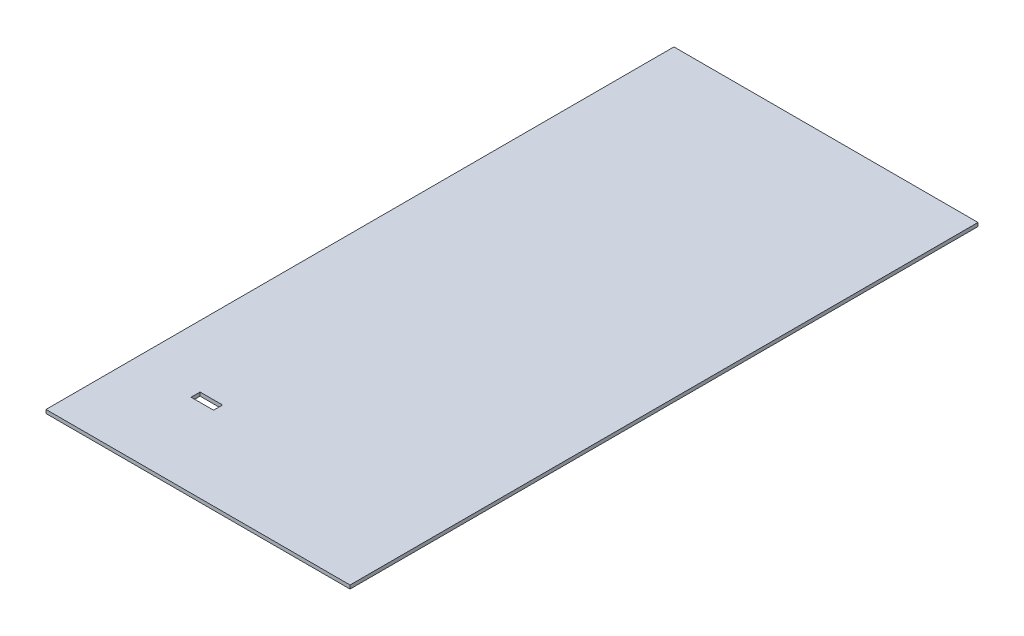
ISO-10303-21;
HEADER;
FILE_DESCRIPTION(('STEP AP214'),'2;1');
FILE_NAME('part.step','',(''),(''),'','','');
FILE_SCHEMA(('AUTOMOTIVE_DESIGN { 1 0 10303 214 1 1 1 1 }'));
ENDSEC;
DATA;
#1=APPLICATION_CONTEXT('core data for automotive mechanical design processes');
#2=APPLICATION_PROTOCOL_DEFINITION('international standard','automotive_design',2000,#1);
#3=PRODUCT_CONTEXT('',#1,'mechanical');
#4=PRODUCT('Part','Part','',(#3));
#5=PRODUCT_RELATED_PRODUCT_CATEGORY('part','',(#4));
#6=PRODUCT_DEFINITION_FORMATION('','',#4);
#7=PRODUCT_DEFINITION_CONTEXT('part definition',#1,'design');
#8=PRODUCT_DEFINITION('design','',#6,#7);
#9=PRODUCT_DEFINITION_SHAPE('','',#8);
#10=(LENGTH_UNIT() NAMED_UNIT(*) SI_UNIT(.MILLI.,.METRE.));
#11=(NAMED_UNIT(*) PLANE_ANGLE_UNIT() SI_UNIT($,.RADIAN.));
#12=(NAMED_UNIT(*) SI_UNIT($,.STERADIAN.) SOLID_ANGLE_UNIT());
#13=UNCERTAINTY_MEASURE_WITH_UNIT(LENGTH_MEASURE(1.E-05),#10,'distance_accuracy_value','');
#14=(GEOMETRIC_REPRESENTATION_CONTEXT(3) GLOBAL_UNCERTAINTY_ASSIGNED_CONTEXT((#13)) GLOBAL_UNIT_ASSIGNED_CONTEXT((#10,
#11,#12)) REPRESENTATION_CONTEXT('',''));
#15=CARTESIAN_POINT('',(0.,0.,0.));
#16=DIRECTION('',(0.,0.,1.));
#17=DIRECTION('',(1.,0.,0.));
#18=AXIS2_PLACEMENT_3D('',#15,#16,#17);
#19=CARTESIAN_POINT('',(-135.,3.175,278.8));
#20=DIRECTION('',(1.,0.,0.));
#21=DIRECTION('',(0.,0.,-1.));
#22=AXIS2_PLACEMENT_3D('',#19,#20,#21);
#23=PLANE('',#22);
#24=DIRECTION('',(0.,0.,1.));
#25=VECTOR('',#24,1.);
#26=CARTESIAN_POINT('',(-135.,0.,278.8));
#27=LINE('',#26,#25);
#28=CARTESIAN_POINT('',(-135.,0.,-278.8));
#29=VERTEX_POINT('',#28);
#30=CARTESIAN_POINT('',(-135.,0.,278.8));
#31=VERTEX_POINT('',#30);
#32=EDGE_CURVE('E134',#29,#31,#27,.T.);
#33=ORIENTED_EDGE('',*,*,#32,.T.);
#34=DIRECTION('',(0.,-1.,0.));
#35=VECTOR('',#34,1.);
#36=CARTESIAN_POINT('',(-135.,3.175,278.8));
#37=LINE('',#36,#35);
#38=CARTESIAN_POINT('',(-135.,3.175,278.8));
#39=VERTEX_POINT('',#38);
#40=EDGE_CURVE('E11',#39,#31,#37,.T.);
#41=ORIENTED_EDGE('',*,*,#40,.F.);
#42=DIRECTION('',(0.,0.,1.));
#43=VECTOR('',#42,1.);
#44=CARTESIAN_POINT('',(-135.,3.175,278.8));
#45=LINE('',#44,#43);
#46=CARTESIAN_POINT('',(-135.,3.175,-278.8));
#47=VERTEX_POINT('',#46);
#48=EDGE_CURVE('E138',#47,#39,#45,.T.);
#49=ORIENTED_EDGE('',*,*,#48,.F.);
#50=DIRECTION('',(0.,-1.,0.));
#51=VECTOR('',#50,1.);
#52=CARTESIAN_POINT('',(-135.,3.175,-278.8));
#53=LINE('',#52,#51);
#54=EDGE_CURVE('E148',#47,#29,#53,.T.);
#55=ORIENTED_EDGE('',*,*,#54,.T.);
#56=EDGE_LOOP('',(#33,#41,#49,#55));
#57=FACE_BOUND('',#56,.T.);
#58=ADVANCED_FACE('F37',(#57),#23,.F.);
#59=CARTESIAN_POINT('',(135.,3.175,278.8));
#60=DIRECTION('',(0.,0.,-1.));
#61=DIRECTION('',(-1.,0.,0.));
#62=AXIS2_PLACEMENT_3D('',#59,#60,#61);
#63=PLANE('',#62);
#64=DIRECTION('',(1.,0.,0.));
#65=VECTOR('',#64,1.);
#66=CARTESIAN_POINT('',(135.,0.,278.8));
#67=LINE('',#66,#65);
#68=CARTESIAN_POINT('',(135.,0.,278.8));
#69=VERTEX_POINT('',#68);
#70=EDGE_CURVE('E151',#31,#69,#67,.T.);
#71=ORIENTED_EDGE('',*,*,#70,.T.);
#72=DIRECTION('',(0.,-1.,0.));
#73=VECTOR('',#72,1.);
#74=CARTESIAN_POINT('',(135.,3.175,278.8));
#75=LINE('',#74,#73);
#76=CARTESIAN_POINT('',(135.,3.175,278.8));
#77=VERTEX_POINT('',#76);
#78=EDGE_CURVE('E44',#77,#69,#75,.T.);
#79=ORIENTED_EDGE('',*,*,#78,.F.);
#80=DIRECTION('',(1.,0.,0.));
#81=VECTOR('',#80,1.);
#82=CARTESIAN_POINT('',(135.,3.175,278.8));
#83=LINE('',#82,#81);
#84=EDGE_CURVE('E141',#39,#77,#83,.T.);
#85=ORIENTED_EDGE('',*,*,#84,.F.);
#86=ORIENTED_EDGE('',*,*,#40,.T.);
#87=EDGE_LOOP('',(#71,#79,#85,#86));
#88=FACE_BOUND('',#87,.T.);
#89=ADVANCED_FACE('F179',(#88),#63,.F.);
#90=CARTESIAN_POINT('',(135.,3.175,278.8));
#91=DIRECTION('',(-1.,0.,0.));
#92=DIRECTION('',(0.,0.,1.));
#93=AXIS2_PLACEMENT_3D('',#90,#91,#92);
#94=PLANE('',#93);
#95=DIRECTION('',(0.,0.,-1.));
#96=VECTOR('',#95,1.);
#97=CARTESIAN_POINT('',(135.,0.,278.8));
#98=LINE('',#97,#96);
#99=CARTESIAN_POINT('',(135.,0.,-278.8));
#100=VERTEX_POINT('',#99);
#101=EDGE_CURVE('E153',#69,#100,#98,.T.);
#102=ORIENTED_EDGE('',*,*,#101,.T.);
#103=DIRECTION('',(0.,-1.,0.));
#104=VECTOR('',#103,1.);
#105=CARTESIAN_POINT('',(135.,3.175,-278.8));
#106=LINE('',#105,#104);
#107=CARTESIAN_POINT('',(135.,3.175,-278.8));
#108=VERTEX_POINT('',#107);
#109=EDGE_CURVE('E158',#108,#100,#106,.T.);
#110=ORIENTED_EDGE('',*,*,#109,.F.);
#111=DIRECTION('',(0.,0.,-1.));
#112=VECTOR('',#111,1.);
#113=CARTESIAN_POINT('',(135.,3.175,278.8));
#114=LINE('',#113,#112);
#115=EDGE_CURVE('E144',#77,#108,#114,.T.);
#116=ORIENTED_EDGE('',*,*,#115,.F.);
#117=ORIENTED_EDGE('',*,*,#78,.T.);
#118=EDGE_LOOP('',(#102,#110,#116,#117));
#119=FACE_BOUND('',#118,.T.);
#120=ADVANCED_FACE('F165',(#119),#94,.F.);
#121=CARTESIAN_POINT('',(135.,3.175,-278.8));
#122=DIRECTION('',(0.,0.,1.));
#123=DIRECTION('',(1.,0.,0.));
#124=AXIS2_PLACEMENT_3D('',#121,#122,#123);
#125=PLANE('',#124);
#126=DIRECTION('',(-1.,0.,0.));
#127=VECTOR('',#126,1.);
#128=CARTESIAN_POINT('',(135.,0.,-278.8));
#129=LINE('',#128,#127);
#130=EDGE_CURVE('E142',#100,#29,#129,.T.);
#131=ORIENTED_EDGE('',*,*,#130,.T.);
#132=ORIENTED_EDGE('',*,*,#54,.F.);
#133=DIRECTION('',(-1.,0.,0.));
#134=VECTOR('',#133,1.);
#135=CARTESIAN_POINT('',(135.,3.175,-278.8));
#136=LINE('',#135,#134);
#137=EDGE_CURVE('E146',#108,#47,#136,.T.);
#138=ORIENTED_EDGE('',*,*,#137,.F.);
#139=ORIENTED_EDGE('',*,*,#109,.T.);
#140=EDGE_LOOP('',(#131,#132,#138,#139));
#141=FACE_BOUND('',#140,.T.);
#142=ADVANCED_FACE('F172',(#141),#125,.F.);
#143=CARTESIAN_POINT('',(0.,3.175,0.));
#144=DIRECTION('',(0.,1.,0.));
#145=DIRECTION('',(0.,0.,1.));
#146=AXIS2_PLACEMENT_3D('',#143,#144,#145);
#147=PLANE('',#146);
#148=DIRECTION('',(0.,0.,1.));
#149=VECTOR('',#148,1.);
#150=CARTESIAN_POINT('',(-80.0000000000001,3.175,205.));
#151=LINE('',#150,#149);
#152=CARTESIAN_POINT('',(-80.0000000000001,3.175,197.));
#153=VERTEX_POINT('',#152);
#154=CARTESIAN_POINT('',(-80.0000000000001,3.175,205.));
#155=VERTEX_POINT('',#154);
#156=EDGE_CURVE('E51',#153,#155,#151,.T.);
#157=ORIENTED_EDGE('',*,*,#156,.F.);
#158=DIRECTION('',(-1.,0.,0.));
#159=VECTOR('',#158,1.);
#160=CARTESIAN_POINT('',(-60.0000000000001,3.175,197.));
#161=LINE('',#160,#159);
#162=CARTESIAN_POINT('',(-60.0000000000001,3.175,197.));
#163=VERTEX_POINT('',#162);
#164=EDGE_CURVE('E119',#163,#153,#161,.T.);
#165=ORIENTED_EDGE('',*,*,#164,.F.);
#166=DIRECTION('',(0.,0.,-1.));
#167=VECTOR('',#166,1.);
#168=CARTESIAN_POINT('',(-60.0000000000001,3.175,205.));
#169=LINE('',#168,#167);
#170=CARTESIAN_POINT('',(-60.0000000000001,3.175,205.));
#171=VERTEX_POINT('',#170);
#172=EDGE_CURVE('E122',#171,#163,#169,.T.);
#173=ORIENTED_EDGE('',*,*,#172,.F.);
#174=DIRECTION('',(1.,0.,0.));
#175=VECTOR('',#174,1.);
#176=CARTESIAN_POINT('',(-60.0000000000001,3.175,205.));
#177=LINE('',#176,#175);
#178=EDGE_CURVE('E128',#155,#171,#177,.T.);
#179=ORIENTED_EDGE('',*,*,#178,.F.);
#180=EDGE_LOOP('',(#157,#165,#173,#179));
#181=FACE_BOUND('',#180,.T.);
#182=ORIENTED_EDGE('',*,*,#48,.T.);
#183=ORIENTED_EDGE('',*,*,#84,.T.);
#184=ORIENTED_EDGE('',*,*,#115,.T.);
#185=ORIENTED_EDGE('',*,*,#137,.T.);
#186=EDGE_LOOP('',(#182,#183,#184,#185));
#187=FACE_BOUND('',#186,.T.);
#188=ADVANCED_FACE('F178',(#181,#187),#147,.T.);
#189=CARTESIAN_POINT('',(0.,0.,0.));
#190=DIRECTION('',(0.,1.,0.));
#191=DIRECTION('',(0.,0.,1.));
#192=AXIS2_PLACEMENT_3D('',#189,#190,#191);
#193=PLANE('',#192);
#194=DIRECTION('',(-1.,0.,0.));
#195=VECTOR('',#194,1.);
#196=CARTESIAN_POINT('',(-60.0000000000001,0.,197.));
#197=LINE('',#196,#195);
#198=CARTESIAN_POINT('',(-60.0000000000001,0.,197.));
#199=VERTEX_POINT('',#198);
#200=CARTESIAN_POINT('',(-80.0000000000001,0.,197.));
#201=VERTEX_POINT('',#200);
#202=EDGE_CURVE('E109',#199,#201,#197,.T.);
#203=ORIENTED_EDGE('',*,*,#202,.T.);
#204=DIRECTION('',(0.,0.,1.));
#205=VECTOR('',#204,1.);
#206=CARTESIAN_POINT('',(-80.0000000000001,0.,205.));
#207=LINE('',#206,#205);
#208=CARTESIAN_POINT('',(-80.0000000000001,0.,205.));
#209=VERTEX_POINT('',#208);
#210=EDGE_CURVE('E103',#201,#209,#207,.T.);
#211=ORIENTED_EDGE('',*,*,#210,.T.);
#212=DIRECTION('',(1.,0.,0.));
#213=VECTOR('',#212,1.);
#214=CARTESIAN_POINT('',(-60.0000000000001,0.,205.));
#215=LINE('',#214,#213);
#216=CARTESIAN_POINT('',(-60.0000000000001,0.,205.));
#217=VERTEX_POINT('',#216);
#218=EDGE_CURVE('E112',#209,#217,#215,.T.);
#219=ORIENTED_EDGE('',*,*,#218,.T.);
#220=DIRECTION('',(0.,0.,-1.));
#221=VECTOR('',#220,1.);
#222=CARTESIAN_POINT('',(-60.0000000000001,0.,205.));
#223=LINE('',#222,#221);
#224=EDGE_CURVE('E59',#217,#199,#223,.T.);
#225=ORIENTED_EDGE('',*,*,#224,.T.);
#226=EDGE_LOOP('',(#203,#211,#219,#225));
#227=FACE_BOUND('',#226,.T.);
#228=ORIENTED_EDGE('',*,*,#32,.F.);
#229=ORIENTED_EDGE('',*,*,#130,.F.);
#230=ORIENTED_EDGE('',*,*,#101,.F.);
#231=ORIENTED_EDGE('',*,*,#70,.F.);
#232=EDGE_LOOP('',(#228,#229,#230,#231));
#233=FACE_BOUND('',#232,.T.);
#234=ADVANCED_FACE('F116',(#227,#233),#193,.F.);
#235=CARTESIAN_POINT('',(-80.0000000000001,0.,205.));
#236=DIRECTION('',(-1.,0.,0.));
#237=DIRECTION('',(0.,0.,1.));
#238=AXIS2_PLACEMENT_3D('',#235,#236,#237);
#239=PLANE('',#238);
#240=ORIENTED_EDGE('',*,*,#156,.T.);
#241=DIRECTION('',(0.,1.,0.));
#242=VECTOR('',#241,1.);
#243=CARTESIAN_POINT('',(-80.0000000000001,0.,205.));
#244=LINE('',#243,#242);
#245=EDGE_CURVE('E99',#209,#155,#244,.T.);
#246=ORIENTED_EDGE('',*,*,#245,.F.);
#247=ORIENTED_EDGE('',*,*,#210,.F.);
#248=DIRECTION('',(0.,1.,0.));
#249=VECTOR('',#248,1.);
#250=CARTESIAN_POINT('',(-80.0000000000001,0.,197.));
#251=LINE('',#250,#249);
#252=EDGE_CURVE('E132',#201,#153,#251,.T.);
#253=ORIENTED_EDGE('',*,*,#252,.T.);
#254=EDGE_LOOP('',(#240,#246,#247,#253));
#255=FACE_BOUND('',#254,.T.);
#256=ADVANCED_FACE('F101',(#255),#239,.F.);
#257=CARTESIAN_POINT('',(-60.0000000000001,0.,197.));
#258=DIRECTION('',(0.,0.,-1.));
#259=DIRECTION('',(-1.,0.,0.));
#260=AXIS2_PLACEMENT_3D('',#257,#258,#259);
#261=PLANE('',#260);
#262=ORIENTED_EDGE('',*,*,#164,.T.);
#263=ORIENTED_EDGE('',*,*,#252,.F.);
#264=ORIENTED_EDGE('',*,*,#202,.F.);
#265=DIRECTION('',(0.,1.,0.));
#266=VECTOR('',#265,1.);
#267=CARTESIAN_POINT('',(-60.0000000000001,0.,197.));
#268=LINE('',#267,#266);
#269=EDGE_CURVE('E135',#199,#163,#268,.T.);
#270=ORIENTED_EDGE('',*,*,#269,.T.);
#271=EDGE_LOOP('',(#262,#263,#264,#270));
#272=FACE_BOUND('',#271,.T.);
#273=ADVANCED_FACE('F196',(#272),#261,.F.);
#274=CARTESIAN_POINT('',(-60.0000000000001,0.,205.));
#275=DIRECTION('',(1.,0.,0.));
#276=DIRECTION('',(0.,0.,-1.));
#277=AXIS2_PLACEMENT_3D('',#274,#275,#276);
#278=PLANE('',#277);
#279=ORIENTED_EDGE('',*,*,#172,.T.);
#280=ORIENTED_EDGE('',*,*,#269,.F.);
#281=ORIENTED_EDGE('',*,*,#224,.F.);
#282=DIRECTION('',(0.,1.,0.));
#283=VECTOR('',#282,1.);
#284=CARTESIAN_POINT('',(-60.0000000000001,0.,205.));
#285=LINE('',#284,#283);
#286=EDGE_CURVE('E108',#217,#171,#285,.T.);
#287=ORIENTED_EDGE('',*,*,#286,.T.);
#288=EDGE_LOOP('',(#279,#280,#281,#287));
#289=FACE_BOUND('',#288,.T.);
#290=ADVANCED_FACE('F199',(#289),#278,.F.);
#291=CARTESIAN_POINT('',(-60.0000000000001,0.,205.));
#292=DIRECTION('',(0.,0.,1.));
#293=DIRECTION('',(1.,0.,0.));
#294=AXIS2_PLACEMENT_3D('',#291,#292,#293);
#295=PLANE('',#294);
#296=ORIENTED_EDGE('',*,*,#178,.T.);
#297=ORIENTED_EDGE('',*,*,#286,.F.);
#298=ORIENTED_EDGE('',*,*,#218,.F.);
#299=ORIENTED_EDGE('',*,*,#245,.T.);
#300=EDGE_LOOP('',(#296,#297,#298,#299));
#301=FACE_BOUND('',#300,.T.);
#302=ADVANCED_FACE('F113',(#301),#295,.F.);
#303=CLOSED_SHELL('',(#58,#89,#120,#142,#188,#234,#256,#273,#290,#302));
#304=MANIFOLD_SOLID_BREP('B2',#303);
#305=ADVANCED_BREP_SHAPE_REPRESENTATION('',(#18,#304),#14);
#306=SHAPE_DEFINITION_REPRESENTATION(#9,#305);
ENDSEC;
END-ISO-10303-21;
